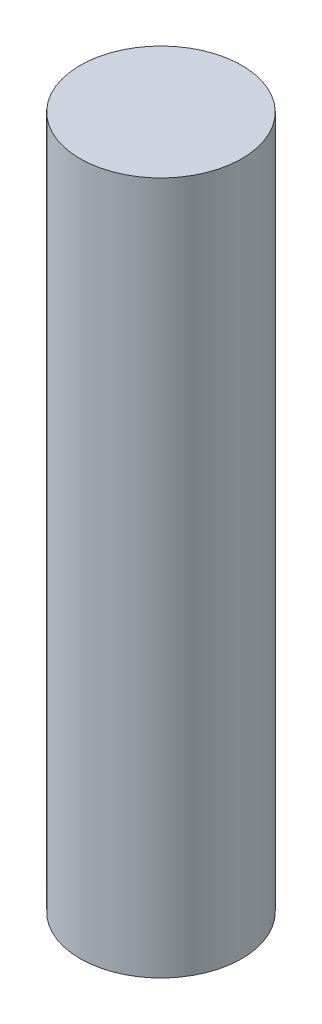
ISO-10303-21;
HEADER;
FILE_DESCRIPTION(('STEP AP214'),'2;1');
FILE_NAME('part.step','',(''),(''),'','','');
FILE_SCHEMA(('AUTOMOTIVE_DESIGN { 1 0 10303 214 1 1 1 1 }'));
ENDSEC;
DATA;
#1=APPLICATION_CONTEXT('core data for automotive mechanical design processes');
#2=APPLICATION_PROTOCOL_DEFINITION('international standard','automotive_design',2000,#1);
#3=PRODUCT_CONTEXT('',#1,'mechanical');
#4=PRODUCT('Part','Part','',(#3));
#5=PRODUCT_RELATED_PRODUCT_CATEGORY('part','',(#4));
#6=PRODUCT_DEFINITION_FORMATION('','',#4);
#7=PRODUCT_DEFINITION_CONTEXT('part definition',#1,'design');
#8=PRODUCT_DEFINITION('design','',#6,#7);
#9=PRODUCT_DEFINITION_SHAPE('','',#8);
#10=(LENGTH_UNIT() NAMED_UNIT(*) SI_UNIT(.MILLI.,.METRE.));
#11=(NAMED_UNIT(*) PLANE_ANGLE_UNIT() SI_UNIT($,.RADIAN.));
#12=(NAMED_UNIT(*) SI_UNIT($,.STERADIAN.) SOLID_ANGLE_UNIT());
#13=UNCERTAINTY_MEASURE_WITH_UNIT(LENGTH_MEASURE(1.E-05),#10,'distance_accuracy_value','');
#14=(GEOMETRIC_REPRESENTATION_CONTEXT(3) GLOBAL_UNCERTAINTY_ASSIGNED_CONTEXT((#13)) GLOBAL_UNIT_ASSIGNED_CONTEXT((#10,
#11,#12)) REPRESENTATION_CONTEXT('',''));
#15=CARTESIAN_POINT('',(0.,0.,0.));
#16=DIRECTION('',(0.,0.,1.));
#17=DIRECTION('',(1.,0.,0.));
#18=AXIS2_PLACEMENT_3D('',#15,#16,#17);
#19=CARTESIAN_POINT('',(0.,15.,0.));
#20=DIRECTION('',(0.,-1.,0.));
#21=DIRECTION('',(0.,0.,-1.));
#22=AXIS2_PLACEMENT_3D('',#19,#20,#21);
#23=CYLINDRICAL_SURFACE('',#22,1.75);
#24=CARTESIAN_POINT('',(0.,15.,0.));
#25=DIRECTION('',(0.,1.,0.));
#26=DIRECTION('',(0.,0.,1.));
#27=AXIS2_PLACEMENT_3D('',#24,#25,#26);
#28=CIRCLE('',#27,1.75);
#29=CARTESIAN_POINT('',(0.,15.,1.75));
#30=VERTEX_POINT('',#29);
#31=EDGE_CURVE('E10',#30,#30,#28,.T.);
#32=ORIENTED_EDGE('',*,*,#31,.F.);
#33=EDGE_LOOP('',(#32));
#34=FACE_BOUND('',#33,.T.);
#35=CARTESIAN_POINT('',(0.,0.,0.));
#36=DIRECTION('',(0.,1.,0.));
#37=DIRECTION('',(0.,0.,1.));
#38=AXIS2_PLACEMENT_3D('',#35,#36,#37);
#39=CIRCLE('',#38,1.75);
#40=CARTESIAN_POINT('',(0.,0.,1.75));
#41=VERTEX_POINT('',#40);
#42=EDGE_CURVE('E34',#41,#41,#39,.T.);
#43=ORIENTED_EDGE('',*,*,#42,.T.);
#44=EDGE_LOOP('',(#43));
#45=FACE_BOUND('',#44,.T.);
#46=ADVANCED_FACE('F31',(#34,#45),#23,.T.);
#47=CARTESIAN_POINT('',(0.,15.,0.));
#48=DIRECTION('',(0.,1.,0.));
#49=DIRECTION('',(0.,0.,1.));
#50=AXIS2_PLACEMENT_3D('',#47,#48,#49);
#51=PLANE('',#50);
#52=ORIENTED_EDGE('',*,*,#31,.T.);
#53=EDGE_LOOP('',(#52));
#54=FACE_BOUND('',#53,.T.);
#55=ADVANCED_FACE('F46',(#54),#51,.T.);
#56=CARTESIAN_POINT('',(0.,0.,0.));
#57=DIRECTION('',(0.,1.,0.));
#58=DIRECTION('',(0.,0.,1.));
#59=AXIS2_PLACEMENT_3D('',#56,#57,#58);
#60=PLANE('',#59);
#61=ORIENTED_EDGE('',*,*,#42,.F.);
#62=EDGE_LOOP('',(#61));
#63=FACE_BOUND('',#62,.T.);
#64=ADVANCED_FACE('F44',(#63),#60,.F.);
#65=CLOSED_SHELL('',(#46,#55,#64));
#66=MANIFOLD_SOLID_BREP('B2',#65);
#67=ADVANCED_BREP_SHAPE_REPRESENTATION('',(#18,#66),#14);
#68=SHAPE_DEFINITION_REPRESENTATION(#9,#67);
ENDSEC;
END-ISO-10303-21;
